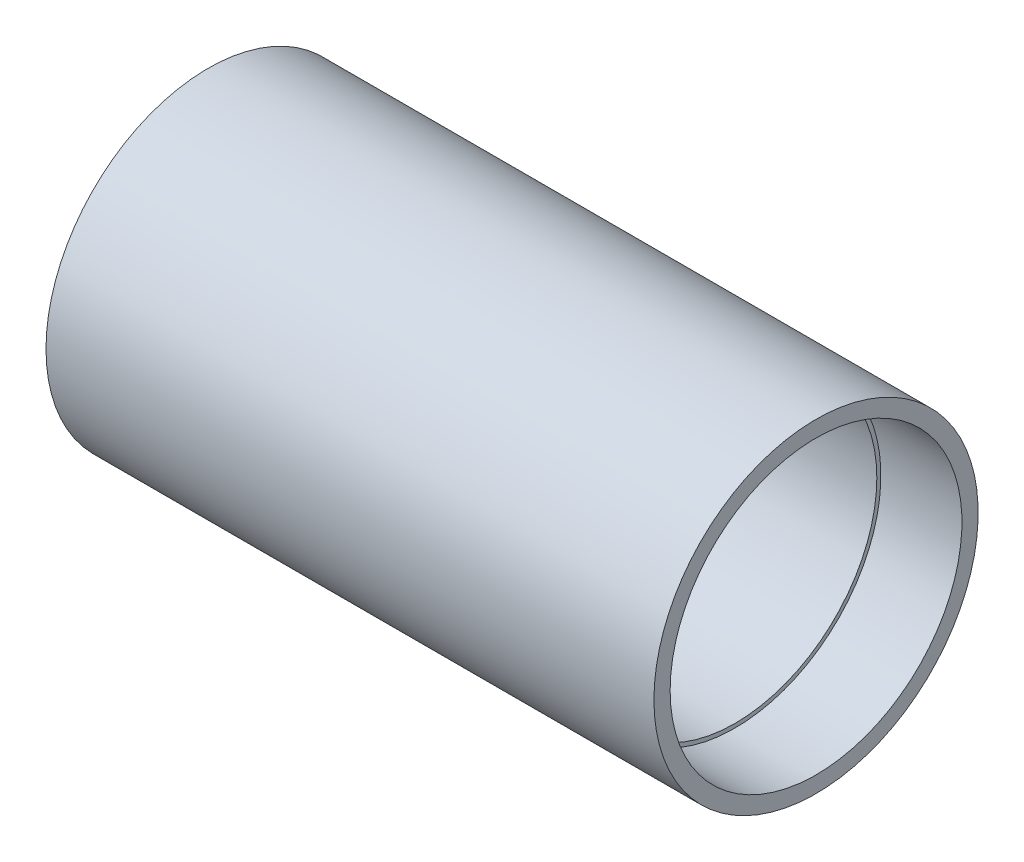
ISO-10303-21;
HEADER;
FILE_DESCRIPTION(('STEP AP214'),'2;1');
FILE_NAME('part.step','',(''),(''),'','','');
FILE_SCHEMA(('AUTOMOTIVE_DESIGN { 1 0 10303 214 1 1 1 1 }'));
ENDSEC;
DATA;
#1=APPLICATION_CONTEXT('core data for automotive mechanical design processes');
#2=APPLICATION_PROTOCOL_DEFINITION('international standard','automotive_design',2000,#1);
#3=PRODUCT_CONTEXT('',#1,'mechanical');
#4=PRODUCT('Part','Part','',(#3));
#5=PRODUCT_RELATED_PRODUCT_CATEGORY('part','',(#4));
#6=PRODUCT_DEFINITION_FORMATION('','',#4);
#7=PRODUCT_DEFINITION_CONTEXT('part definition',#1,'design');
#8=PRODUCT_DEFINITION('design','',#6,#7);
#9=PRODUCT_DEFINITION_SHAPE('','',#8);
#10=(LENGTH_UNIT() NAMED_UNIT(*) SI_UNIT(.MILLI.,.METRE.));
#11=(NAMED_UNIT(*) PLANE_ANGLE_UNIT() SI_UNIT($,.RADIAN.));
#12=(NAMED_UNIT(*) SI_UNIT($,.STERADIAN.) SOLID_ANGLE_UNIT());
#13=UNCERTAINTY_MEASURE_WITH_UNIT(LENGTH_MEASURE(1.E-05),#10,'distance_accuracy_value','');
#14=(GEOMETRIC_REPRESENTATION_CONTEXT(3) GLOBAL_UNCERTAINTY_ASSIGNED_CONTEXT((#13)) GLOBAL_UNIT_ASSIGNED_CONTEXT((#10,
#11,#12)) REPRESENTATION_CONTEXT('',''));
#15=CARTESIAN_POINT('',(0.,0.,0.));
#16=DIRECTION('',(0.,0.,1.));
#17=DIRECTION('',(1.,0.,0.));
#18=AXIS2_PLACEMENT_3D('',#15,#16,#17);
#19=CARTESIAN_POINT('',(-150.,36.,0.));
#20=DIRECTION('',(1.,0.,0.));
#21=DIRECTION('',(0.,0.,-1.));
#22=AXIS2_PLACEMENT_3D('',#19,#20,#21);
#23=PLANE('',#22);
#24=CARTESIAN_POINT('',(-150.,0.,0.));
#25=DIRECTION('',(-1.,0.,0.));
#26=DIRECTION('',(0.,0.,1.));
#27=AXIS2_PLACEMENT_3D('',#24,#25,#26);
#28=CIRCLE('',#27,36.);
#29=CARTESIAN_POINT('',(-150.,0.,36.));
#30=VERTEX_POINT('',#29);
#31=EDGE_CURVE('E65',#30,#30,#28,.T.);
#32=ORIENTED_EDGE('',*,*,#31,.F.);
#33=EDGE_LOOP('',(#32));
#34=FACE_BOUND('',#33,.T.);
#35=CARTESIAN_POINT('',(-150.,0.,0.));
#36=DIRECTION('',(-1.,0.,0.));
#37=DIRECTION('',(0.,0.,1.));
#38=AXIS2_PLACEMENT_3D('',#35,#36,#37);
#39=CIRCLE('',#38,40.);
#40=CARTESIAN_POINT('',(-150.,0.,40.));
#41=VERTEX_POINT('',#40);
#42=EDGE_CURVE('E10',#41,#41,#39,.T.);
#43=ORIENTED_EDGE('',*,*,#42,.T.);
#44=EDGE_LOOP('',(#43));
#45=FACE_BOUND('',#44,.T.);
#46=ADVANCED_FACE('F37',(#34,#45),#23,.F.);
#47=CARTESIAN_POINT('',(-88.99,0.,0.));
#48=DIRECTION('',(-1.,0.,0.));
#49=DIRECTION('',(0.,0.,1.));
#50=AXIS2_PLACEMENT_3D('',#47,#48,#49);
#51=CYLINDRICAL_SURFACE('',#50,40.);
#52=ORIENTED_EDGE('',*,*,#42,.F.);
#53=EDGE_LOOP('',(#52));
#54=FACE_BOUND('',#53,.T.);
#55=CARTESIAN_POINT('',(0.,0.,0.));
#56=DIRECTION('',(-1.,0.,0.));
#57=DIRECTION('',(0.,0.,1.));
#58=AXIS2_PLACEMENT_3D('',#55,#56,#57);
#59=CIRCLE('',#58,40.);
#60=CARTESIAN_POINT('',(0.,0.,40.));
#61=VERTEX_POINT('',#60);
#62=EDGE_CURVE('E43',#61,#61,#59,.T.);
#63=ORIENTED_EDGE('',*,*,#62,.T.);
#64=EDGE_LOOP('',(#63));
#65=FACE_BOUND('',#64,.T.);
#66=ADVANCED_FACE('F72',(#54,#65),#51,.T.);
#67=CARTESIAN_POINT('',(0.,40.,0.));
#68=DIRECTION('',(-1.,0.,0.));
#69=DIRECTION('',(0.,0.,1.));
#70=AXIS2_PLACEMENT_3D('',#67,#68,#69);
#71=PLANE('',#70);
#72=ORIENTED_EDGE('',*,*,#62,.F.);
#73=EDGE_LOOP('',(#72));
#74=FACE_BOUND('',#73,.T.);
#75=CARTESIAN_POINT('',(0.,0.,0.));
#76=DIRECTION('',(-1.,0.,0.));
#77=DIRECTION('',(0.,0.,1.));
#78=AXIS2_PLACEMENT_3D('',#75,#76,#77);
#79=CIRCLE('',#78,36.);
#80=CARTESIAN_POINT('',(0.,0.,36.));
#81=VERTEX_POINT('',#80);
#82=EDGE_CURVE('E47',#81,#81,#79,.T.);
#83=ORIENTED_EDGE('',*,*,#82,.T.);
#84=EDGE_LOOP('',(#83));
#85=FACE_BOUND('',#84,.T.);
#86=ADVANCED_FACE('F76',(#74,#85),#71,.F.);
#87=CARTESIAN_POINT('',(-88.99,0.,0.));
#88=DIRECTION('',(-1.,0.,0.));
#89=DIRECTION('',(0.,0.,1.));
#90=AXIS2_PLACEMENT_3D('',#87,#88,#89);
#91=CYLINDRICAL_SURFACE('',#90,36.);
#92=ORIENTED_EDGE('',*,*,#82,.F.);
#93=EDGE_LOOP('',(#92));
#94=FACE_BOUND('',#93,.T.);
#95=CARTESIAN_POINT('',(-20.,0.,0.));
#96=DIRECTION('',(-1.,0.,0.));
#97=DIRECTION('',(0.,0.,1.));
#98=AXIS2_PLACEMENT_3D('',#95,#96,#97);
#99=CIRCLE('',#98,36.);
#100=CARTESIAN_POINT('',(-20.,0.,36.));
#101=VERTEX_POINT('',#100);
#102=EDGE_CURVE('E51',#101,#101,#99,.T.);
#103=ORIENTED_EDGE('',*,*,#102,.T.);
#104=EDGE_LOOP('',(#103));
#105=FACE_BOUND('',#104,.T.);
#106=ADVANCED_FACE('F81',(#94,#105),#91,.F.);
#107=CARTESIAN_POINT('',(-20.,36.,0.));
#108=DIRECTION('',(-1.,0.,0.));
#109=DIRECTION('',(0.,0.,1.));
#110=AXIS2_PLACEMENT_3D('',#107,#108,#109);
#111=PLANE('',#110);
#112=ORIENTED_EDGE('',*,*,#102,.F.);
#113=EDGE_LOOP('',(#112));
#114=FACE_BOUND('',#113,.T.);
#115=CARTESIAN_POINT('',(-20.,0.,0.));
#116=DIRECTION('',(-1.,0.,0.));
#117=DIRECTION('',(0.,0.,1.));
#118=AXIS2_PLACEMENT_3D('',#115,#116,#117);
#119=CIRCLE('',#118,35.);
#120=CARTESIAN_POINT('',(-20.,0.,35.));
#121=VERTEX_POINT('',#120);
#122=EDGE_CURVE('E56',#121,#121,#119,.T.);
#123=ORIENTED_EDGE('',*,*,#122,.T.);
#124=EDGE_LOOP('',(#123));
#125=FACE_BOUND('',#124,.T.);
#126=ADVANCED_FACE('F87',(#114,#125),#111,.F.);
#127=CARTESIAN_POINT('',(-88.99,0.,0.));
#128=DIRECTION('',(-1.,0.,0.));
#129=DIRECTION('',(0.,0.,1.));
#130=AXIS2_PLACEMENT_3D('',#127,#128,#129);
#131=CYLINDRICAL_SURFACE('',#130,35.);
#132=ORIENTED_EDGE('',*,*,#122,.F.);
#133=EDGE_LOOP('',(#132));
#134=FACE_BOUND('',#133,.T.);
#135=CARTESIAN_POINT('',(-130.,0.,0.));
#136=DIRECTION('',(-1.,0.,0.));
#137=DIRECTION('',(0.,0.,1.));
#138=AXIS2_PLACEMENT_3D('',#135,#136,#137);
#139=CIRCLE('',#138,35.);
#140=CARTESIAN_POINT('',(-130.,0.,35.));
#141=VERTEX_POINT('',#140);
#142=EDGE_CURVE('E59',#141,#141,#139,.T.);
#143=ORIENTED_EDGE('',*,*,#142,.T.);
#144=EDGE_LOOP('',(#143));
#145=FACE_BOUND('',#144,.T.);
#146=ADVANCED_FACE('F91',(#134,#145),#131,.F.);
#147=CARTESIAN_POINT('',(-130.,35.,0.));
#148=DIRECTION('',(1.,0.,0.));
#149=DIRECTION('',(0.,0.,-1.));
#150=AXIS2_PLACEMENT_3D('',#147,#148,#149);
#151=PLANE('',#150);
#152=ORIENTED_EDGE('',*,*,#142,.F.);
#153=EDGE_LOOP('',(#152));
#154=FACE_BOUND('',#153,.T.);
#155=CARTESIAN_POINT('',(-130.,0.,0.));
#156=DIRECTION('',(-1.,0.,0.));
#157=DIRECTION('',(0.,0.,1.));
#158=AXIS2_PLACEMENT_3D('',#155,#156,#157);
#159=CIRCLE('',#158,36.);
#160=CARTESIAN_POINT('',(-130.,0.,36.));
#161=VERTEX_POINT('',#160);
#162=EDGE_CURVE('E62',#161,#161,#159,.T.);
#163=ORIENTED_EDGE('',*,*,#162,.T.);
#164=EDGE_LOOP('',(#163));
#165=FACE_BOUND('',#164,.T.);
#166=ADVANCED_FACE('F95',(#154,#165),#151,.F.);
#167=CARTESIAN_POINT('',(-88.99,0.,0.));
#168=DIRECTION('',(-1.,0.,0.));
#169=DIRECTION('',(0.,0.,1.));
#170=AXIS2_PLACEMENT_3D('',#167,#168,#169);
#171=CYLINDRICAL_SURFACE('',#170,36.);
#172=ORIENTED_EDGE('',*,*,#162,.F.);
#173=EDGE_LOOP('',(#172));
#174=FACE_BOUND('',#173,.T.);
#175=ORIENTED_EDGE('',*,*,#31,.T.);
#176=EDGE_LOOP('',(#175));
#177=FACE_BOUND('',#176,.T.);
#178=ADVANCED_FACE('F69',(#174,#177),#171,.F.);
#179=CLOSED_SHELL('',(#46,#66,#86,#106,#126,#146,#166,#178));
#180=MANIFOLD_SOLID_BREP('B2',#179);
#181=ADVANCED_BREP_SHAPE_REPRESENTATION('',(#18,#180),#14);
#182=SHAPE_DEFINITION_REPRESENTATION(#9,#181);
ENDSEC;
END-ISO-10303-21;
